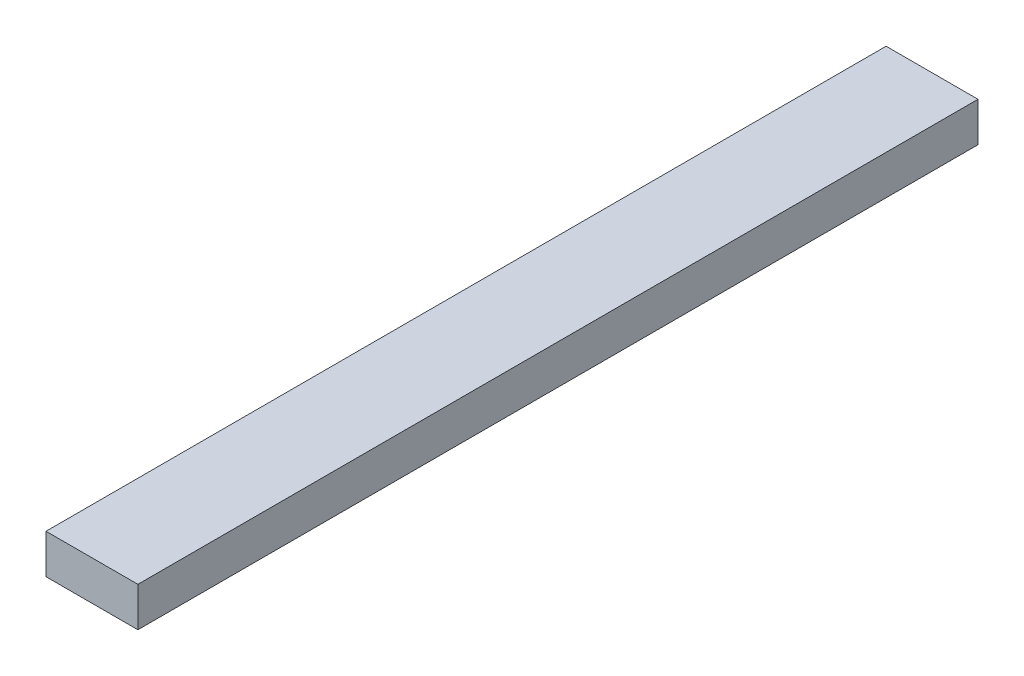
ISO-10303-21;
HEADER;
FILE_DESCRIPTION(('STEP AP214'),'2;1');
FILE_NAME('part.step','',(''),(''),'','','');
FILE_SCHEMA(('AUTOMOTIVE_DESIGN { 1 0 10303 214 1 1 1 1 }'));
ENDSEC;
DATA;
#1=APPLICATION_CONTEXT('core data for automotive mechanical design processes');
#2=APPLICATION_PROTOCOL_DEFINITION('international standard','automotive_design',2000,#1);
#3=PRODUCT_CONTEXT('',#1,'mechanical');
#4=PRODUCT('Part','Part','',(#3));
#5=PRODUCT_RELATED_PRODUCT_CATEGORY('part','',(#4));
#6=PRODUCT_DEFINITION_FORMATION('','',#4);
#7=PRODUCT_DEFINITION_CONTEXT('part definition',#1,'design');
#8=PRODUCT_DEFINITION('design','',#6,#7);
#9=PRODUCT_DEFINITION_SHAPE('','',#8);
#10=(LENGTH_UNIT() NAMED_UNIT(*) SI_UNIT(.MILLI.,.METRE.));
#11=(NAMED_UNIT(*) PLANE_ANGLE_UNIT() SI_UNIT($,.RADIAN.));
#12=(NAMED_UNIT(*) SI_UNIT($,.STERADIAN.) SOLID_ANGLE_UNIT());
#13=UNCERTAINTY_MEASURE_WITH_UNIT(LENGTH_MEASURE(1.E-05),#10,'distance_accuracy_value','');
#14=(GEOMETRIC_REPRESENTATION_CONTEXT(3) GLOBAL_UNCERTAINTY_ASSIGNED_CONTEXT((#13)) GLOBAL_UNIT_ASSIGNED_CONTEXT((#10,
#11,#12)) REPRESENTATION_CONTEXT('',''));
#15=CARTESIAN_POINT('',(0.,0.,0.));
#16=DIRECTION('',(0.,0.,1.));
#17=DIRECTION('',(1.,0.,0.));
#18=AXIS2_PLACEMENT_3D('',#15,#16,#17);
#19=CARTESIAN_POINT('',(44.45,-19.05,812.8));
#20=DIRECTION('',(0.,-1.,0.));
#21=DIRECTION('',(1.,0.,0.));
#22=AXIS2_PLACEMENT_3D('',#19,#20,#21);
#23=PLANE('',#22);
#24=DIRECTION('',(-1.,0.,0.));
#25=VECTOR('',#24,1.);
#26=CARTESIAN_POINT('',(44.45,-19.05,0.));
#27=LINE('',#26,#25);
#28=CARTESIAN_POINT('',(44.45,-19.05,0.));
#29=VERTEX_POINT('',#28);
#30=CARTESIAN_POINT('',(-44.45,-19.05,0.));
#31=VERTEX_POINT('',#30);
#32=EDGE_CURVE('E110',#29,#31,#27,.T.);
#33=ORIENTED_EDGE('',*,*,#32,.F.);
#34=DIRECTION('',(0.,0.,-1.));
#35=VECTOR('',#34,1.);
#36=CARTESIAN_POINT('',(44.45,-19.05,812.8));
#37=LINE('',#36,#35);
#38=CARTESIAN_POINT('',(44.45,-19.05,812.8));
#39=VERTEX_POINT('',#38);
#40=EDGE_CURVE('E11',#39,#29,#37,.T.);
#41=ORIENTED_EDGE('',*,*,#40,.F.);
#42=DIRECTION('',(-1.,0.,0.));
#43=VECTOR('',#42,1.);
#44=CARTESIAN_POINT('',(44.45,-19.05,812.8));
#45=LINE('',#44,#43);
#46=CARTESIAN_POINT('',(-44.45,-19.05,812.8));
#47=VERTEX_POINT('',#46);
#48=EDGE_CURVE('E103',#39,#47,#45,.T.);
#49=ORIENTED_EDGE('',*,*,#48,.T.);
#50=DIRECTION('',(0.,0.,-1.));
#51=VECTOR('',#50,1.);
#52=CARTESIAN_POINT('',(-44.45,-19.05,812.8));
#53=LINE('',#52,#51);
#54=EDGE_CURVE('E42',#47,#31,#53,.T.);
#55=ORIENTED_EDGE('',*,*,#54,.T.);
#56=EDGE_LOOP('',(#33,#41,#49,#55));
#57=FACE_BOUND('',#56,.T.);
#58=ADVANCED_FACE('F39',(#57),#23,.T.);
#59=CARTESIAN_POINT('',(44.45,-19.05,812.8));
#60=DIRECTION('',(-1.,0.,0.));
#61=DIRECTION('',(0.,0.,1.));
#62=AXIS2_PLACEMENT_3D('',#59,#60,#61);
#63=PLANE('',#62);
#64=DIRECTION('',(0.,1.,0.));
#65=VECTOR('',#64,1.);
#66=CARTESIAN_POINT('',(44.45,-19.05,0.));
#67=LINE('',#66,#65);
#68=CARTESIAN_POINT('',(44.45,19.05,0.));
#69=VERTEX_POINT('',#68);
#70=EDGE_CURVE('E73',#29,#69,#67,.T.);
#71=ORIENTED_EDGE('',*,*,#70,.T.);
#72=DIRECTION('',(0.,0.,-1.));
#73=VECTOR('',#72,1.);
#74=CARTESIAN_POINT('',(44.45,19.05,812.8));
#75=LINE('',#74,#73);
#76=CARTESIAN_POINT('',(44.45,19.05,812.8));
#77=VERTEX_POINT('',#76);
#78=EDGE_CURVE('E49',#77,#69,#75,.T.);
#79=ORIENTED_EDGE('',*,*,#78,.F.);
#80=DIRECTION('',(0.,1.,0.));
#81=VECTOR('',#80,1.);
#82=CARTESIAN_POINT('',(44.45,-19.05,812.8));
#83=LINE('',#82,#81);
#84=EDGE_CURVE('E90',#39,#77,#83,.T.);
#85=ORIENTED_EDGE('',*,*,#84,.F.);
#86=ORIENTED_EDGE('',*,*,#40,.T.);
#87=EDGE_LOOP('',(#71,#79,#85,#86));
#88=FACE_BOUND('',#87,.T.);
#89=ADVANCED_FACE('F126',(#88),#63,.F.);
#90=CARTESIAN_POINT('',(44.45,19.05,812.8));
#91=DIRECTION('',(0.,-1.,0.));
#92=DIRECTION('',(1.,0.,0.));
#93=AXIS2_PLACEMENT_3D('',#90,#91,#92);
#94=PLANE('',#93);
#95=DIRECTION('',(-1.,0.,0.));
#96=VECTOR('',#95,1.);
#97=CARTESIAN_POINT('',(44.45,19.05,0.));
#98=LINE('',#97,#96);
#99=CARTESIAN_POINT('',(-44.45,19.05,0.));
#100=VERTEX_POINT('',#99);
#101=EDGE_CURVE('E98',#69,#100,#98,.T.);
#102=ORIENTED_EDGE('',*,*,#101,.T.);
#103=DIRECTION('',(0.,0.,-1.));
#104=VECTOR('',#103,1.);
#105=CARTESIAN_POINT('',(-44.45,19.05,812.8));
#106=LINE('',#105,#104);
#107=CARTESIAN_POINT('',(-44.45,19.05,812.8));
#108=VERTEX_POINT('',#107);
#109=EDGE_CURVE('E95',#108,#100,#106,.T.);
#110=ORIENTED_EDGE('',*,*,#109,.F.);
#111=DIRECTION('',(-1.,0.,0.));
#112=VECTOR('',#111,1.);
#113=CARTESIAN_POINT('',(44.45,19.05,812.8));
#114=LINE('',#113,#112);
#115=EDGE_CURVE('E85',#77,#108,#114,.T.);
#116=ORIENTED_EDGE('',*,*,#115,.F.);
#117=ORIENTED_EDGE('',*,*,#78,.T.);
#118=EDGE_LOOP('',(#102,#110,#116,#117));
#119=FACE_BOUND('',#118,.T.);
#120=ADVANCED_FACE('F96',(#119),#94,.F.);
#121=CARTESIAN_POINT('',(-44.45,-19.05,812.8));
#122=DIRECTION('',(-1.,0.,0.));
#123=DIRECTION('',(0.,0.,1.));
#124=AXIS2_PLACEMENT_3D('',#121,#122,#123);
#125=PLANE('',#124);
#126=DIRECTION('',(0.,1.,0.));
#127=VECTOR('',#126,1.);
#128=CARTESIAN_POINT('',(-44.45,-19.05,0.));
#129=LINE('',#128,#127);
#130=EDGE_CURVE('E114',#31,#100,#129,.T.);
#131=ORIENTED_EDGE('',*,*,#130,.F.);
#132=ORIENTED_EDGE('',*,*,#54,.F.);
#133=DIRECTION('',(0.,1.,0.));
#134=VECTOR('',#133,1.);
#135=CARTESIAN_POINT('',(-44.45,-19.05,812.8));
#136=LINE('',#135,#134);
#137=EDGE_CURVE('E89',#47,#108,#136,.T.);
#138=ORIENTED_EDGE('',*,*,#137,.T.);
#139=ORIENTED_EDGE('',*,*,#109,.T.);
#140=EDGE_LOOP('',(#131,#132,#138,#139));
#141=FACE_BOUND('',#140,.T.);
#142=ADVANCED_FACE('F101',(#141),#125,.T.);
#143=CARTESIAN_POINT('',(0.,0.,812.8));
#144=DIRECTION('',(0.,0.,-1.));
#145=DIRECTION('',(-1.,0.,0.));
#146=AXIS2_PLACEMENT_3D('',#143,#144,#145);
#147=PLANE('',#146);
#148=ORIENTED_EDGE('',*,*,#48,.F.);
#149=ORIENTED_EDGE('',*,*,#84,.T.);
#150=ORIENTED_EDGE('',*,*,#115,.T.);
#151=ORIENTED_EDGE('',*,*,#137,.F.);
#152=EDGE_LOOP('',(#148,#149,#150,#151));
#153=FACE_BOUND('',#152,.T.);
#154=ADVANCED_FACE('F88',(#153),#147,.F.);
#155=CARTESIAN_POINT('',(0.,0.,0.));
#156=DIRECTION('',(0.,0.,-1.));
#157=DIRECTION('',(-1.,0.,0.));
#158=AXIS2_PLACEMENT_3D('',#155,#156,#157);
#159=PLANE('',#158);
#160=ORIENTED_EDGE('',*,*,#32,.T.);
#161=ORIENTED_EDGE('',*,*,#130,.T.);
#162=ORIENTED_EDGE('',*,*,#101,.F.);
#163=ORIENTED_EDGE('',*,*,#70,.F.);
#164=EDGE_LOOP('',(#160,#161,#162,#163));
#165=FACE_BOUND('',#164,.T.);
#166=ADVANCED_FACE('F123',(#165),#159,.T.);
#167=CLOSED_SHELL('',(#58,#89,#120,#142,#154,#166));
#168=MANIFOLD_SOLID_BREP('B2',#167);
#169=ADVANCED_BREP_SHAPE_REPRESENTATION('',(#18,#168),#14);
#170=SHAPE_DEFINITION_REPRESENTATION(#9,#169);
ENDSEC;
END-ISO-10303-21;
